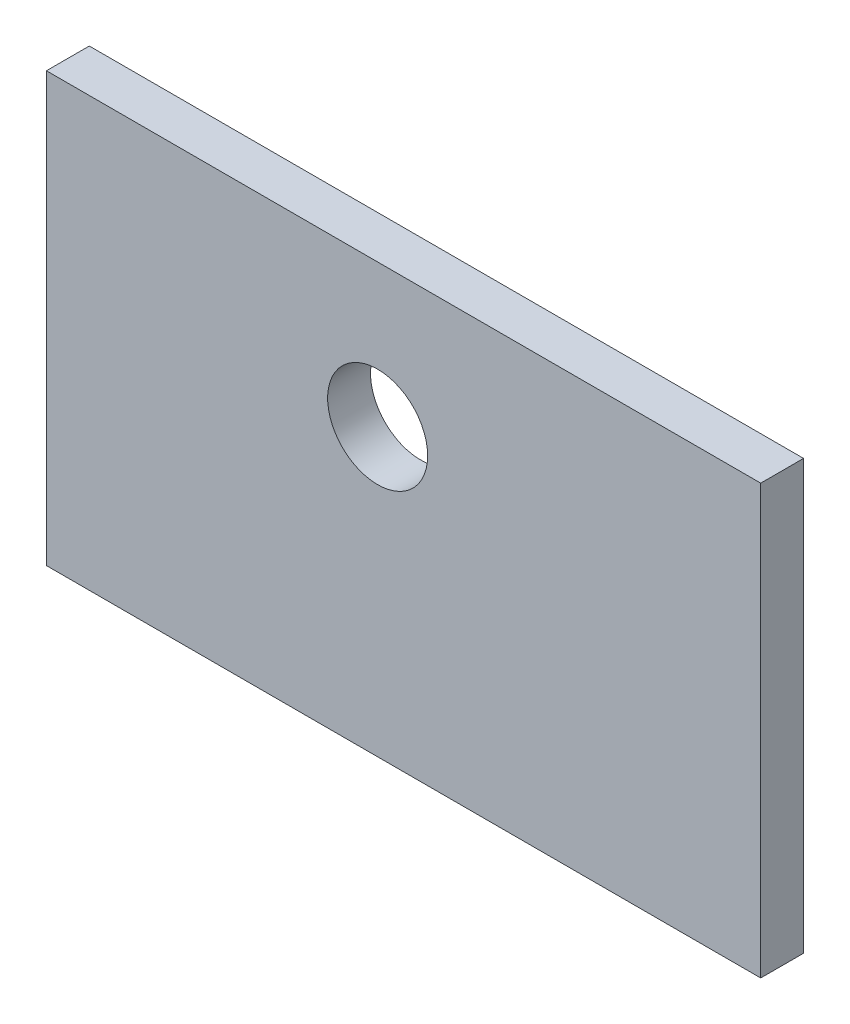
ISO-10303-21;
HEADER;
FILE_DESCRIPTION(('STEP AP214'),'2;1');
FILE_NAME('part.step','',(''),(''),'','','');
FILE_SCHEMA(('AUTOMOTIVE_DESIGN { 1 0 10303 214 1 1 1 1 }'));
ENDSEC;
DATA;
#1=APPLICATION_CONTEXT('core data for automotive mechanical design processes');
#2=APPLICATION_PROTOCOL_DEFINITION('international standard','automotive_design',2000,#1);
#3=PRODUCT_CONTEXT('',#1,'mechanical');
#4=PRODUCT('Part','Part','',(#3));
#5=PRODUCT_RELATED_PRODUCT_CATEGORY('part','',(#4));
#6=PRODUCT_DEFINITION_FORMATION('','',#4);
#7=PRODUCT_DEFINITION_CONTEXT('part definition',#1,'design');
#8=PRODUCT_DEFINITION('design','',#6,#7);
#9=PRODUCT_DEFINITION_SHAPE('','',#8);
#10=(LENGTH_UNIT() NAMED_UNIT(*) SI_UNIT(.MILLI.,.METRE.));
#11=(NAMED_UNIT(*) PLANE_ANGLE_UNIT() SI_UNIT($,.RADIAN.));
#12=(NAMED_UNIT(*) SI_UNIT($,.STERADIAN.) SOLID_ANGLE_UNIT());
#13=UNCERTAINTY_MEASURE_WITH_UNIT(LENGTH_MEASURE(1.E-05),#10,'distance_accuracy_value','');
#14=(GEOMETRIC_REPRESENTATION_CONTEXT(3) GLOBAL_UNCERTAINTY_ASSIGNED_CONTEXT((#13)) GLOBAL_UNIT_ASSIGNED_CONTEXT((#10,
#11,#12)) REPRESENTATION_CONTEXT('',''));
#15=CARTESIAN_POINT('',(0.,0.,0.));
#16=DIRECTION('',(0.,0.,1.));
#17=DIRECTION('',(1.,0.,0.));
#18=AXIS2_PLACEMENT_3D('',#15,#16,#17);
#19=CARTESIAN_POINT('',(0.,0.,3.));
#20=DIRECTION('',(0.,0.,-1.));
#21=DIRECTION('',(-1.,0.,0.));
#22=AXIS2_PLACEMENT_3D('',#19,#20,#21);
#23=PLANE('',#22);
#24=DIRECTION('',(0.,-1.,0.));
#25=VECTOR('',#24,1.);
#26=CARTESIAN_POINT('',(0.,0.,3.));
#27=LINE('',#26,#25);
#28=CARTESIAN_POINT('',(0.,30.,3.));
#29=VERTEX_POINT('',#28);
#30=CARTESIAN_POINT('',(0.,0.,3.));
#31=VERTEX_POINT('',#30);
#32=EDGE_CURVE('E95',#29,#31,#27,.T.);
#33=ORIENTED_EDGE('',*,*,#32,.T.);
#34=DIRECTION('',(1.,0.,0.));
#35=VECTOR('',#34,1.);
#36=CARTESIAN_POINT('',(0.,0.,3.));
#37=LINE('',#36,#35);
#38=CARTESIAN_POINT('',(50.,0.,3.));
#39=VERTEX_POINT('',#38);
#40=EDGE_CURVE('E90',#31,#39,#37,.T.);
#41=ORIENTED_EDGE('',*,*,#40,.T.);
#42=DIRECTION('',(0.,1.,0.));
#43=VECTOR('',#42,1.);
#44=CARTESIAN_POINT('',(50.,0.,3.));
#45=LINE('',#44,#43);
#46=CARTESIAN_POINT('',(50.,30.,3.));
#47=VERTEX_POINT('',#46);
#48=EDGE_CURVE('E93',#39,#47,#45,.T.);
#49=ORIENTED_EDGE('',*,*,#48,.T.);
#50=DIRECTION('',(-1.,0.,0.));
#51=VECTOR('',#50,1.);
#52=CARTESIAN_POINT('',(0.,30.,3.));
#53=LINE('',#52,#51);
#54=EDGE_CURVE('E60',#47,#29,#53,.T.);
#55=ORIENTED_EDGE('',*,*,#54,.T.);
#56=EDGE_LOOP('',(#33,#41,#49,#55));
#57=FACE_BOUND('',#56,.T.);
#58=CARTESIAN_POINT('',(23.185014847565,20.,3.));
#59=DIRECTION('',(0.,0.,1.));
#60=DIRECTION('',(1.,0.,0.));
#61=AXIS2_PLACEMENT_3D('',#58,#59,#60);
#62=CIRCLE('',#61,3.5);
#63=CARTESIAN_POINT('',(26.685014847565,20.,3.));
#64=VERTEX_POINT('',#63);
#65=EDGE_CURVE('E110',#64,#64,#62,.T.);
#66=ORIENTED_EDGE('',*,*,#65,.F.);
#67=EDGE_LOOP('',(#66));
#68=FACE_BOUND('',#67,.T.);
#69=ADVANCED_FACE('F43',(#57,#68),#23,.F.);
#70=CARTESIAN_POINT('',(0.,0.,0.));
#71=DIRECTION('',(0.,0.,-1.));
#72=DIRECTION('',(-1.,0.,0.));
#73=AXIS2_PLACEMENT_3D('',#70,#71,#72);
#74=PLANE('',#73);
#75=DIRECTION('',(0.,-1.,0.));
#76=VECTOR('',#75,1.);
#77=CARTESIAN_POINT('',(0.,0.,0.));
#78=LINE('',#77,#76);
#79=CARTESIAN_POINT('',(0.,30.,0.));
#80=VERTEX_POINT('',#79);
#81=CARTESIAN_POINT('',(0.,0.,0.));
#82=VERTEX_POINT('',#81);
#83=EDGE_CURVE('E107',#80,#82,#78,.T.);
#84=ORIENTED_EDGE('',*,*,#83,.F.);
#85=DIRECTION('',(-1.,0.,0.));
#86=VECTOR('',#85,1.);
#87=CARTESIAN_POINT('',(0.,30.,0.));
#88=LINE('',#87,#86);
#89=CARTESIAN_POINT('',(50.,30.,0.));
#90=VERTEX_POINT('',#89);
#91=EDGE_CURVE('E83',#90,#80,#88,.T.);
#92=ORIENTED_EDGE('',*,*,#91,.F.);
#93=DIRECTION('',(0.,1.,0.));
#94=VECTOR('',#93,1.);
#95=CARTESIAN_POINT('',(50.,0.,0.));
#96=LINE('',#95,#94);
#97=CARTESIAN_POINT('',(50.,0.,0.));
#98=VERTEX_POINT('',#97);
#99=EDGE_CURVE('E77',#98,#90,#96,.T.);
#100=ORIENTED_EDGE('',*,*,#99,.F.);
#101=DIRECTION('',(1.,0.,0.));
#102=VECTOR('',#101,1.);
#103=CARTESIAN_POINT('',(0.,0.,0.));
#104=LINE('',#103,#102);
#105=EDGE_CURVE('E99',#82,#98,#104,.T.);
#106=ORIENTED_EDGE('',*,*,#105,.F.);
#107=EDGE_LOOP('',(#84,#92,#100,#106));
#108=FACE_BOUND('',#107,.T.);
#109=CARTESIAN_POINT('',(23.185014847565,20.,0.));
#110=DIRECTION('',(0.,0.,1.));
#111=DIRECTION('',(1.,0.,0.));
#112=AXIS2_PLACEMENT_3D('',#109,#110,#111);
#113=CIRCLE('',#112,3.5);
#114=CARTESIAN_POINT('',(26.685014847565,20.,0.));
#115=VERTEX_POINT('',#114);
#116=EDGE_CURVE('E122',#115,#115,#113,.T.);
#117=ORIENTED_EDGE('',*,*,#116,.T.);
#118=EDGE_LOOP('',(#117));
#119=FACE_BOUND('',#118,.T.);
#120=ADVANCED_FACE('F118',(#108,#119),#74,.T.);
#121=CARTESIAN_POINT('',(0.,0.,3.));
#122=DIRECTION('',(1.,0.,0.));
#123=DIRECTION('',(0.,0.,-1.));
#124=AXIS2_PLACEMENT_3D('',#121,#122,#123);
#125=PLANE('',#124);
#126=ORIENTED_EDGE('',*,*,#83,.T.);
#127=DIRECTION('',(0.,0.,-1.));
#128=VECTOR('',#127,1.);
#129=CARTESIAN_POINT('',(0.,0.,3.));
#130=LINE('',#129,#128);
#131=EDGE_CURVE('E11',#31,#82,#130,.T.);
#132=ORIENTED_EDGE('',*,*,#131,.F.);
#133=ORIENTED_EDGE('',*,*,#32,.F.);
#134=DIRECTION('',(0.,0.,-1.));
#135=VECTOR('',#134,1.);
#136=CARTESIAN_POINT('',(0.,30.,3.));
#137=LINE('',#136,#135);
#138=EDGE_CURVE('E103',#29,#80,#137,.T.);
#139=ORIENTED_EDGE('',*,*,#138,.T.);
#140=EDGE_LOOP('',(#126,#132,#133,#139));
#141=FACE_BOUND('',#140,.T.);
#142=ADVANCED_FACE('F45',(#141),#125,.F.);
#143=CARTESIAN_POINT('',(0.,0.,3.));
#144=DIRECTION('',(0.,1.,0.));
#145=DIRECTION('',(0.,0.,1.));
#146=AXIS2_PLACEMENT_3D('',#143,#144,#145);
#147=PLANE('',#146);
#148=ORIENTED_EDGE('',*,*,#105,.T.);
#149=DIRECTION('',(0.,0.,-1.));
#150=VECTOR('',#149,1.);
#151=CARTESIAN_POINT('',(50.,0.,3.));
#152=LINE('',#151,#150);
#153=EDGE_CURVE('E52',#39,#98,#152,.T.);
#154=ORIENTED_EDGE('',*,*,#153,.F.);
#155=ORIENTED_EDGE('',*,*,#40,.F.);
#156=ORIENTED_EDGE('',*,*,#131,.T.);
#157=EDGE_LOOP('',(#148,#154,#155,#156));
#158=FACE_BOUND('',#157,.T.);
#159=ADVANCED_FACE('F98',(#158),#147,.F.);
#160=CARTESIAN_POINT('',(50.,0.,3.));
#161=DIRECTION('',(-1.,0.,0.));
#162=DIRECTION('',(0.,0.,1.));
#163=AXIS2_PLACEMENT_3D('',#160,#161,#162);
#164=PLANE('',#163);
#165=ORIENTED_EDGE('',*,*,#99,.T.);
#166=DIRECTION('',(0.,0.,-1.));
#167=VECTOR('',#166,1.);
#168=CARTESIAN_POINT('',(50.,30.,3.));
#169=LINE('',#168,#167);
#170=EDGE_CURVE('E100',#47,#90,#169,.T.);
#171=ORIENTED_EDGE('',*,*,#170,.F.);
#172=ORIENTED_EDGE('',*,*,#48,.F.);
#173=ORIENTED_EDGE('',*,*,#153,.T.);
#174=EDGE_LOOP('',(#165,#171,#172,#173));
#175=FACE_BOUND('',#174,.T.);
#176=ADVANCED_FACE('F101',(#175),#164,.F.);
#177=CARTESIAN_POINT('',(0.,30.,3.));
#178=DIRECTION('',(0.,-1.,0.));
#179=DIRECTION('',(0.,0.,-1.));
#180=AXIS2_PLACEMENT_3D('',#177,#178,#179);
#181=PLANE('',#180);
#182=ORIENTED_EDGE('',*,*,#91,.T.);
#183=ORIENTED_EDGE('',*,*,#138,.F.);
#184=ORIENTED_EDGE('',*,*,#54,.F.);
#185=ORIENTED_EDGE('',*,*,#170,.T.);
#186=EDGE_LOOP('',(#182,#183,#184,#185));
#187=FACE_BOUND('',#186,.T.);
#188=ADVANCED_FACE('F115',(#187),#181,.F.);
#189=CARTESIAN_POINT('',(23.185014847565,20.,3.));
#190=DIRECTION('',(0.,0.,-1.));
#191=DIRECTION('',(-1.,0.,0.));
#192=AXIS2_PLACEMENT_3D('',#189,#190,#191);
#193=CYLINDRICAL_SURFACE('',#192,3.5);
#194=ORIENTED_EDGE('',*,*,#65,.T.);
#195=EDGE_LOOP('',(#194));
#196=FACE_BOUND('',#195,.T.);
#197=ORIENTED_EDGE('',*,*,#116,.F.);
#198=EDGE_LOOP('',(#197));
#199=FACE_BOUND('',#198,.T.);
#200=ADVANCED_FACE('F128',(#196,#199),#193,.F.);
#201=CLOSED_SHELL('',(#69,#120,#142,#159,#176,#188,#200));
#202=MANIFOLD_SOLID_BREP('B2',#201);
#203=ADVANCED_BREP_SHAPE_REPRESENTATION('',(#18,#202),#14);
#204=SHAPE_DEFINITION_REPRESENTATION(#9,#203);
ENDSEC;
END-ISO-10303-21;
